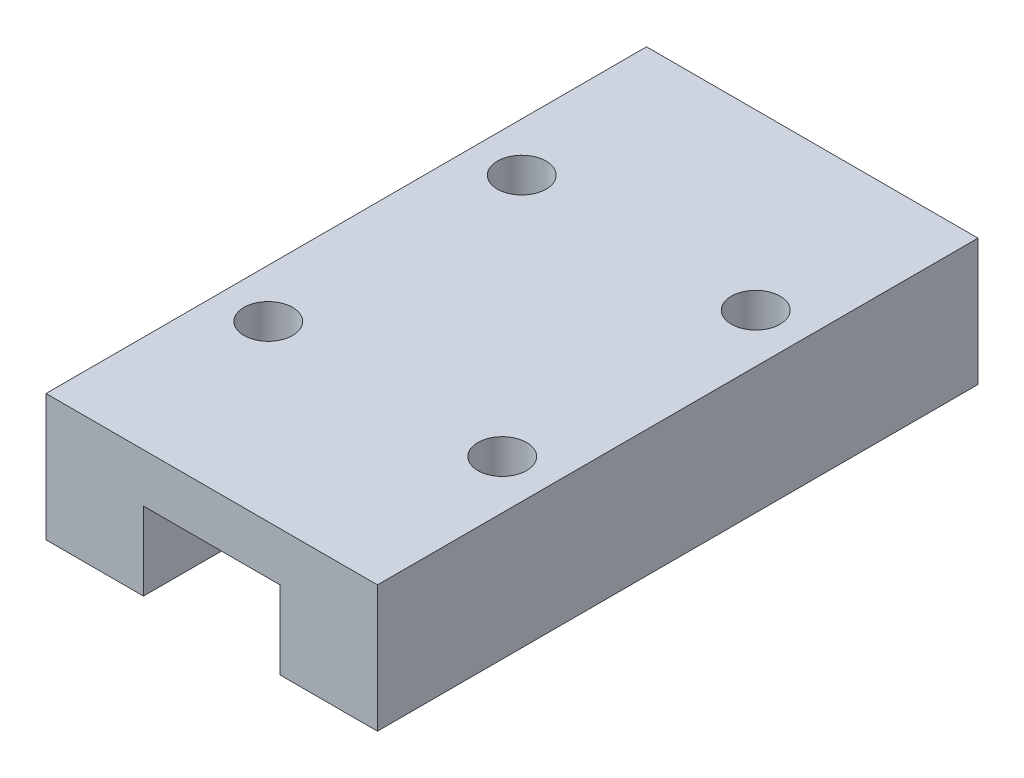
ISO-10303-21;
HEADER;
FILE_DESCRIPTION(('STEP AP214'),'2;1');
FILE_NAME('part.step','',(''),(''),'','','');
FILE_SCHEMA(('AUTOMOTIVE_DESIGN { 1 0 10303 214 1 1 1 1 }'));
ENDSEC;
DATA;
#1=APPLICATION_CONTEXT('core data for automotive mechanical design processes');
#2=APPLICATION_PROTOCOL_DEFINITION('international standard','automotive_design',2000,#1);
#3=PRODUCT_CONTEXT('',#1,'mechanical');
#4=PRODUCT('Part','Part','',(#3));
#5=PRODUCT_RELATED_PRODUCT_CATEGORY('part','',(#4));
#6=PRODUCT_DEFINITION_FORMATION('','',#4);
#7=PRODUCT_DEFINITION_CONTEXT('part definition',#1,'design');
#8=PRODUCT_DEFINITION('design','',#6,#7);
#9=PRODUCT_DEFINITION_SHAPE('','',#8);
#10=(LENGTH_UNIT() NAMED_UNIT(*) SI_UNIT(.MILLI.,.METRE.));
#11=(NAMED_UNIT(*) PLANE_ANGLE_UNIT() SI_UNIT($,.RADIAN.));
#12=(NAMED_UNIT(*) SI_UNIT($,.STERADIAN.) SOLID_ANGLE_UNIT());
#13=UNCERTAINTY_MEASURE_WITH_UNIT(LENGTH_MEASURE(1.E-05),#10,'distance_accuracy_value','');
#14=(GEOMETRIC_REPRESENTATION_CONTEXT(3) GLOBAL_UNCERTAINTY_ASSIGNED_CONTEXT((#13)) GLOBAL_UNIT_ASSIGNED_CONTEXT((#10,
#11,#12)) REPRESENTATION_CONTEXT('',''));
#15=CARTESIAN_POINT('',(0.,0.,0.));
#16=DIRECTION('',(0.,0.,1.));
#17=DIRECTION('',(1.,0.,0.));
#18=AXIS2_PLACEMENT_3D('',#15,#16,#17);
#19=CARTESIAN_POINT('',(0.,6.5,30.8));
#20=DIRECTION('',(1.,0.,0.));
#21=DIRECTION('',(0.,1.,0.));
#22=AXIS2_PLACEMENT_3D('',#19,#20,#21);
#23=PLANE('',#22);
#24=DIRECTION('',(0.,-1.,0.));
#25=VECTOR('',#24,1.);
#26=CARTESIAN_POINT('',(0.,6.5,0.));
#27=LINE('',#26,#25);
#28=CARTESIAN_POINT('',(0.,6.5,0.));
#29=VERTEX_POINT('',#28);
#30=CARTESIAN_POINT('',(0.,0.,0.));
#31=VERTEX_POINT('',#30);
#32=EDGE_CURVE('E135',#29,#31,#27,.T.);
#33=ORIENTED_EDGE('',*,*,#32,.T.);
#34=DIRECTION('',(0.,0.,-1.));
#35=VECTOR('',#34,1.);
#36=CARTESIAN_POINT('',(0.,0.,30.8));
#37=LINE('',#36,#35);
#38=CARTESIAN_POINT('',(0.,0.,30.8));
#39=VERTEX_POINT('',#38);
#40=EDGE_CURVE('E11',#39,#31,#37,.T.);
#41=ORIENTED_EDGE('',*,*,#40,.F.);
#42=DIRECTION('',(0.,-1.,0.));
#43=VECTOR('',#42,1.);
#44=CARTESIAN_POINT('',(0.,6.5,30.8));
#45=LINE('',#44,#43);
#46=CARTESIAN_POINT('',(0.,6.5,30.8));
#47=VERTEX_POINT('',#46);
#48=EDGE_CURVE('E150',#47,#39,#45,.T.);
#49=ORIENTED_EDGE('',*,*,#48,.F.);
#50=DIRECTION('',(0.,0.,-1.));
#51=VECTOR('',#50,1.);
#52=CARTESIAN_POINT('',(0.,6.5,30.8));
#53=LINE('',#52,#51);
#54=EDGE_CURVE('E131',#47,#29,#53,.T.);
#55=ORIENTED_EDGE('',*,*,#54,.T.);
#56=EDGE_LOOP('',(#33,#41,#49,#55));
#57=FACE_BOUND('',#56,.T.);
#58=ADVANCED_FACE('F39',(#57),#23,.F.);
#59=CARTESIAN_POINT('',(0.,0.,30.8));
#60=DIRECTION('',(0.,1.,0.));
#61=DIRECTION('',(0.,0.,1.));
#62=AXIS2_PLACEMENT_3D('',#59,#60,#61);
#63=PLANE('',#62);
#64=CARTESIAN_POINT('',(2.5,0.,8.9));
#65=DIRECTION('',(0.,1.,0.));
#66=DIRECTION('',(0.,0.,1.));
#67=AXIS2_PLACEMENT_3D('',#64,#65,#66);
#68=CIRCLE('',#67,1.25);
#69=CARTESIAN_POINT('',(1.25,0.,8.9));
#70=VERTEX_POINT('',#69);
#71=EDGE_CURVE('E139',#70,#70,#68,.T.);
#72=ORIENTED_EDGE('',*,*,#71,.T.);
#73=EDGE_LOOP('',(#72));
#74=FACE_BOUND('',#73,.T.);
#75=CARTESIAN_POINT('',(2.5,0.,21.9));
#76=DIRECTION('',(0.,1.,0.));
#77=DIRECTION('',(0.,0.,1.));
#78=AXIS2_PLACEMENT_3D('',#75,#76,#77);
#79=CIRCLE('',#78,1.25);
#80=CARTESIAN_POINT('',(1.25,0.,21.9));
#81=VERTEX_POINT('',#80);
#82=EDGE_CURVE('E185',#81,#81,#79,.T.);
#83=ORIENTED_EDGE('',*,*,#82,.T.);
#84=EDGE_LOOP('',(#83));
#85=FACE_BOUND('',#84,.T.);
#86=DIRECTION('',(1.,0.,0.));
#87=VECTOR('',#86,1.);
#88=CARTESIAN_POINT('',(0.,0.,0.));
#89=LINE('',#88,#87);
#90=CARTESIAN_POINT('',(5.,0.,0.));
#91=VERTEX_POINT('',#90);
#92=EDGE_CURVE('E138',#31,#91,#89,.T.);
#93=ORIENTED_EDGE('',*,*,#92,.T.);
#94=DIRECTION('',(0.,0.,-1.));
#95=VECTOR('',#94,1.);
#96=CARTESIAN_POINT('',(5.,0.,30.8));
#97=LINE('',#96,#95);
#98=CARTESIAN_POINT('',(5.,0.,30.8));
#99=VERTEX_POINT('',#98);
#100=EDGE_CURVE('E47',#99,#91,#97,.T.);
#101=ORIENTED_EDGE('',*,*,#100,.F.);
#102=DIRECTION('',(1.,0.,0.));
#103=VECTOR('',#102,1.);
#104=CARTESIAN_POINT('',(0.,0.,30.8));
#105=LINE('',#104,#103);
#106=EDGE_CURVE('E98',#39,#99,#105,.T.);
#107=ORIENTED_EDGE('',*,*,#106,.F.);
#108=ORIENTED_EDGE('',*,*,#40,.T.);
#109=EDGE_LOOP('',(#93,#101,#107,#108));
#110=FACE_BOUND('',#109,.T.);
#111=ADVANCED_FACE('F234',(#74,#85,#110),#63,.F.);
#112=CARTESIAN_POINT('',(5.,0.,30.8));
#113=DIRECTION('',(-1.,0.,0.));
#114=DIRECTION('',(0.,0.,1.));
#115=AXIS2_PLACEMENT_3D('',#112,#113,#114);
#116=PLANE('',#115);
#117=DIRECTION('',(0.,1.,0.));
#118=VECTOR('',#117,1.);
#119=CARTESIAN_POINT('',(5.,0.,0.));
#120=LINE('',#119,#118);
#121=CARTESIAN_POINT('',(5.,4.,0.));
#122=VERTEX_POINT('',#121);
#123=EDGE_CURVE('E141',#91,#122,#120,.T.);
#124=ORIENTED_EDGE('',*,*,#123,.T.);
#125=DIRECTION('',(0.,0.,-1.));
#126=VECTOR('',#125,1.);
#127=CARTESIAN_POINT('',(5.,4.,30.8));
#128=LINE('',#127,#126);
#129=CARTESIAN_POINT('',(5.,4.,30.8));
#130=VERTEX_POINT('',#129);
#131=EDGE_CURVE('E157',#130,#122,#128,.T.);
#132=ORIENTED_EDGE('',*,*,#131,.F.);
#133=DIRECTION('',(0.,1.,0.));
#134=VECTOR('',#133,1.);
#135=CARTESIAN_POINT('',(5.,0.,30.8));
#136=LINE('',#135,#134);
#137=EDGE_CURVE('E165',#99,#130,#136,.T.);
#138=ORIENTED_EDGE('',*,*,#137,.F.);
#139=ORIENTED_EDGE('',*,*,#100,.T.);
#140=EDGE_LOOP('',(#124,#132,#138,#139));
#141=FACE_BOUND('',#140,.T.);
#142=ADVANCED_FACE('F163',(#141),#116,.F.);
#143=CARTESIAN_POINT('',(5.,4.,30.8));
#144=DIRECTION('',(0.,1.,0.));
#145=DIRECTION('',(-1.,0.,0.));
#146=AXIS2_PLACEMENT_3D('',#143,#144,#145);
#147=PLANE('',#146);
#148=DIRECTION('',(1.,0.,0.));
#149=VECTOR('',#148,1.);
#150=CARTESIAN_POINT('',(5.,4.,0.));
#151=LINE('',#150,#149);
#152=CARTESIAN_POINT('',(12.,4.,0.));
#153=VERTEX_POINT('',#152);
#154=EDGE_CURVE('E143',#122,#153,#151,.T.);
#155=ORIENTED_EDGE('',*,*,#154,.T.);
#156=DIRECTION('',(0.,0.,-1.));
#157=VECTOR('',#156,1.);
#158=CARTESIAN_POINT('',(12.,4.,30.8));
#159=LINE('',#158,#157);
#160=CARTESIAN_POINT('',(12.,4.,30.8));
#161=VERTEX_POINT('',#160);
#162=EDGE_CURVE('E154',#161,#153,#159,.T.);
#163=ORIENTED_EDGE('',*,*,#162,.F.);
#164=DIRECTION('',(1.,0.,0.));
#165=VECTOR('',#164,1.);
#166=CARTESIAN_POINT('',(5.,4.,30.8));
#167=LINE('',#166,#165);
#168=EDGE_CURVE('E177',#130,#161,#167,.T.);
#169=ORIENTED_EDGE('',*,*,#168,.F.);
#170=ORIENTED_EDGE('',*,*,#131,.T.);
#171=EDGE_LOOP('',(#155,#163,#169,#170));
#172=FACE_BOUND('',#171,.T.);
#173=ADVANCED_FACE('F173',(#172),#147,.F.);
#174=CARTESIAN_POINT('',(12.,4.,30.8));
#175=DIRECTION('',(1.,0.,0.));
#176=DIRECTION('',(0.,0.,-1.));
#177=AXIS2_PLACEMENT_3D('',#174,#175,#176);
#178=PLANE('',#177);
#179=DIRECTION('',(0.,-1.,0.));
#180=VECTOR('',#179,1.);
#181=CARTESIAN_POINT('',(12.,4.,0.));
#182=LINE('',#181,#180);
#183=CARTESIAN_POINT('',(12.,0.,0.));
#184=VERTEX_POINT('',#183);
#185=EDGE_CURVE('E145',#153,#184,#182,.T.);
#186=ORIENTED_EDGE('',*,*,#185,.T.);
#187=DIRECTION('',(0.,0.,-1.));
#188=VECTOR('',#187,1.);
#189=CARTESIAN_POINT('',(12.,0.,30.8));
#190=LINE('',#189,#188);
#191=CARTESIAN_POINT('',(12.,0.,30.8));
#192=VERTEX_POINT('',#191);
#193=EDGE_CURVE('E126',#192,#184,#190,.T.);
#194=ORIENTED_EDGE('',*,*,#193,.F.);
#195=DIRECTION('',(0.,-1.,0.));
#196=VECTOR('',#195,1.);
#197=CARTESIAN_POINT('',(12.,4.,30.8));
#198=LINE('',#197,#196);
#199=EDGE_CURVE('E117',#161,#192,#198,.T.);
#200=ORIENTED_EDGE('',*,*,#199,.F.);
#201=ORIENTED_EDGE('',*,*,#162,.T.);
#202=EDGE_LOOP('',(#186,#194,#200,#201));
#203=FACE_BOUND('',#202,.T.);
#204=ADVANCED_FACE('F176',(#203),#178,.F.);
#205=CARTESIAN_POINT('',(12.,0.,30.8));
#206=DIRECTION('',(0.,1.,0.));
#207=DIRECTION('',(0.,0.,1.));
#208=AXIS2_PLACEMENT_3D('',#205,#206,#207);
#209=PLANE('',#208);
#210=CARTESIAN_POINT('',(14.5,0.,21.9));
#211=DIRECTION('',(0.,1.,0.));
#212=DIRECTION('',(0.,0.,1.));
#213=AXIS2_PLACEMENT_3D('',#210,#211,#212);
#214=CIRCLE('',#213,1.25);
#215=CARTESIAN_POINT('',(13.25,0.,21.9));
#216=VERTEX_POINT('',#215);
#217=EDGE_CURVE('E188',#216,#216,#214,.T.);
#218=ORIENTED_EDGE('',*,*,#217,.T.);
#219=EDGE_LOOP('',(#218));
#220=FACE_BOUND('',#219,.T.);
#221=CARTESIAN_POINT('',(14.5,0.,8.9));
#222=DIRECTION('',(0.,1.,0.));
#223=DIRECTION('',(0.,0.,1.));
#224=AXIS2_PLACEMENT_3D('',#221,#222,#223);
#225=CIRCLE('',#224,1.25);
#226=CARTESIAN_POINT('',(13.25,0.,8.9));
#227=VERTEX_POINT('',#226);
#228=EDGE_CURVE('E191',#227,#227,#225,.T.);
#229=ORIENTED_EDGE('',*,*,#228,.T.);
#230=EDGE_LOOP('',(#229));
#231=FACE_BOUND('',#230,.T.);
#232=DIRECTION('',(1.,0.,0.));
#233=VECTOR('',#232,1.);
#234=CARTESIAN_POINT('',(12.,0.,0.));
#235=LINE('',#234,#233);
#236=CARTESIAN_POINT('',(17.,0.,0.));
#237=VERTEX_POINT('',#236);
#238=EDGE_CURVE('E125',#184,#237,#235,.T.);
#239=ORIENTED_EDGE('',*,*,#238,.T.);
#240=DIRECTION('',(0.,0.,-1.));
#241=VECTOR('',#240,1.);
#242=CARTESIAN_POINT('',(17.,0.,30.8));
#243=LINE('',#242,#241);
#244=CARTESIAN_POINT('',(17.,0.,30.8));
#245=VERTEX_POINT('',#244);
#246=EDGE_CURVE('E122',#245,#237,#243,.T.);
#247=ORIENTED_EDGE('',*,*,#246,.F.);
#248=DIRECTION('',(1.,0.,0.));
#249=VECTOR('',#248,1.);
#250=CARTESIAN_POINT('',(12.,0.,30.8));
#251=LINE('',#250,#249);
#252=EDGE_CURVE('E111',#192,#245,#251,.T.);
#253=ORIENTED_EDGE('',*,*,#252,.F.);
#254=ORIENTED_EDGE('',*,*,#193,.T.);
#255=EDGE_LOOP('',(#239,#247,#253,#254));
#256=FACE_BOUND('',#255,.T.);
#257=ADVANCED_FACE('F123',(#220,#231,#256),#209,.F.);
#258=CARTESIAN_POINT('',(17.,0.,30.8));
#259=DIRECTION('',(-1.,0.,0.));
#260=DIRECTION('',(0.,0.,1.));
#261=AXIS2_PLACEMENT_3D('',#258,#259,#260);
#262=PLANE('',#261);
#263=DIRECTION('',(0.,1.,0.));
#264=VECTOR('',#263,1.);
#265=CARTESIAN_POINT('',(17.,0.,0.));
#266=LINE('',#265,#264);
#267=CARTESIAN_POINT('',(17.,6.5,0.));
#268=VERTEX_POINT('',#267);
#269=EDGE_CURVE('E84',#237,#268,#266,.T.);
#270=ORIENTED_EDGE('',*,*,#269,.T.);
#271=DIRECTION('',(0.,0.,-1.));
#272=VECTOR('',#271,1.);
#273=CARTESIAN_POINT('',(17.,6.5,30.8));
#274=LINE('',#273,#272);
#275=CARTESIAN_POINT('',(17.,6.5,30.8));
#276=VERTEX_POINT('',#275);
#277=EDGE_CURVE('E127',#276,#268,#274,.T.);
#278=ORIENTED_EDGE('',*,*,#277,.F.);
#279=DIRECTION('',(0.,1.,0.));
#280=VECTOR('',#279,1.);
#281=CARTESIAN_POINT('',(17.,0.,30.8));
#282=LINE('',#281,#280);
#283=EDGE_CURVE('E115',#245,#276,#282,.T.);
#284=ORIENTED_EDGE('',*,*,#283,.F.);
#285=ORIENTED_EDGE('',*,*,#246,.T.);
#286=EDGE_LOOP('',(#270,#278,#284,#285));
#287=FACE_BOUND('',#286,.T.);
#288=ADVANCED_FACE('F129',(#287),#262,.F.);
#289=CARTESIAN_POINT('',(17.,6.5,30.8));
#290=DIRECTION('',(0.,-1.,0.));
#291=DIRECTION('',(1.,0.,0.));
#292=AXIS2_PLACEMENT_3D('',#289,#290,#291);
#293=PLANE('',#292);
#294=CARTESIAN_POINT('',(2.5,6.5,8.9));
#295=DIRECTION('',(0.,1.,0.));
#296=DIRECTION('',(1.,0.,0.));
#297=AXIS2_PLACEMENT_3D('',#294,#295,#296);
#298=CIRCLE('',#297,1.25);
#299=CARTESIAN_POINT('',(1.25,6.5,8.9));
#300=VERTEX_POINT('',#299);
#301=EDGE_CURVE('E198',#300,#300,#298,.T.);
#302=ORIENTED_EDGE('',*,*,#301,.F.);
#303=EDGE_LOOP('',(#302));
#304=FACE_BOUND('',#303,.T.);
#305=CARTESIAN_POINT('',(2.5,6.5,21.9));
#306=DIRECTION('',(0.,1.,0.));
#307=DIRECTION('',(1.,0.,0.));
#308=AXIS2_PLACEMENT_3D('',#305,#306,#307);
#309=CIRCLE('',#308,1.25);
#310=CARTESIAN_POINT('',(1.25,6.5,21.9));
#311=VERTEX_POINT('',#310);
#312=EDGE_CURVE('E201',#311,#311,#309,.T.);
#313=ORIENTED_EDGE('',*,*,#312,.F.);
#314=EDGE_LOOP('',(#313));
#315=FACE_BOUND('',#314,.T.);
#316=CARTESIAN_POINT('',(14.5,6.5,21.9));
#317=DIRECTION('',(0.,1.,0.));
#318=DIRECTION('',(-1.,0.,0.));
#319=AXIS2_PLACEMENT_3D('',#316,#317,#318);
#320=CIRCLE('',#319,1.25);
#321=CARTESIAN_POINT('',(13.25,6.5,21.9));
#322=VERTEX_POINT('',#321);
#323=EDGE_CURVE('E197',#322,#322,#320,.T.);
#324=ORIENTED_EDGE('',*,*,#323,.F.);
#325=EDGE_LOOP('',(#324));
#326=FACE_BOUND('',#325,.T.);
#327=CARTESIAN_POINT('',(14.5,6.5,8.9));
#328=DIRECTION('',(0.,1.,0.));
#329=DIRECTION('',(-1.,0.,0.));
#330=AXIS2_PLACEMENT_3D('',#327,#328,#329);
#331=CIRCLE('',#330,1.25);
#332=CARTESIAN_POINT('',(13.25,6.5,8.9));
#333=VERTEX_POINT('',#332);
#334=EDGE_CURVE('E194',#333,#333,#331,.T.);
#335=ORIENTED_EDGE('',*,*,#334,.F.);
#336=EDGE_LOOP('',(#335));
#337=FACE_BOUND('',#336,.T.);
#338=DIRECTION('',(-1.,0.,0.));
#339=VECTOR('',#338,1.);
#340=CARTESIAN_POINT('',(17.,6.5,0.));
#341=LINE('',#340,#339);
#342=EDGE_CURVE('E90',#268,#29,#341,.T.);
#343=ORIENTED_EDGE('',*,*,#342,.T.);
#344=ORIENTED_EDGE('',*,*,#54,.F.);
#345=DIRECTION('',(-1.,0.,0.));
#346=VECTOR('',#345,1.);
#347=CARTESIAN_POINT('',(17.,6.5,30.8));
#348=LINE('',#347,#346);
#349=EDGE_CURVE('E55',#276,#47,#348,.T.);
#350=ORIENTED_EDGE('',*,*,#349,.F.);
#351=ORIENTED_EDGE('',*,*,#277,.T.);
#352=EDGE_LOOP('',(#343,#344,#350,#351));
#353=FACE_BOUND('',#352,.T.);
#354=ADVANCED_FACE('F210',(#304,#315,#326,#337,#353),#293,.F.);
#355=CARTESIAN_POINT('',(0.,0.,30.8));
#356=DIRECTION('',(0.,0.,1.));
#357=DIRECTION('',(1.,0.,0.));
#358=AXIS2_PLACEMENT_3D('',#355,#356,#357);
#359=PLANE('',#358);
#360=ORIENTED_EDGE('',*,*,#48,.T.);
#361=ORIENTED_EDGE('',*,*,#106,.T.);
#362=ORIENTED_EDGE('',*,*,#137,.T.);
#363=ORIENTED_EDGE('',*,*,#168,.T.);
#364=ORIENTED_EDGE('',*,*,#199,.T.);
#365=ORIENTED_EDGE('',*,*,#252,.T.);
#366=ORIENTED_EDGE('',*,*,#283,.T.);
#367=ORIENTED_EDGE('',*,*,#349,.T.);
#368=EDGE_LOOP('',(#360,#361,#362,#363,#364,#365,#366,#367));
#369=FACE_BOUND('',#368,.T.);
#370=ADVANCED_FACE('F113',(#369),#359,.T.);
#371=CARTESIAN_POINT('',(0.,0.,0.));
#372=DIRECTION('',(0.,0.,1.));
#373=DIRECTION('',(1.,0.,0.));
#374=AXIS2_PLACEMENT_3D('',#371,#372,#373);
#375=PLANE('',#374);
#376=ORIENTED_EDGE('',*,*,#32,.F.);
#377=ORIENTED_EDGE('',*,*,#342,.F.);
#378=ORIENTED_EDGE('',*,*,#269,.F.);
#379=ORIENTED_EDGE('',*,*,#238,.F.);
#380=ORIENTED_EDGE('',*,*,#185,.F.);
#381=ORIENTED_EDGE('',*,*,#154,.F.);
#382=ORIENTED_EDGE('',*,*,#123,.F.);
#383=ORIENTED_EDGE('',*,*,#92,.F.);
#384=EDGE_LOOP('',(#376,#377,#378,#379,#380,#381,#382,#383));
#385=FACE_BOUND('',#384,.T.);
#386=ADVANCED_FACE('F169',(#385),#375,.F.);
#387=CARTESIAN_POINT('',(14.5,-16.,8.9));
#388=DIRECTION('',(0.,1.,0.));
#389=DIRECTION('',(-1.,0.,0.));
#390=AXIS2_PLACEMENT_3D('',#387,#388,#389);
#391=CYLINDRICAL_SURFACE('',#390,1.25);
#392=CARTESIAN_POINT('',(13.25,6.5,8.9));
#393=CARTESIAN_POINT('',(13.25,6.43229166666667,8.9));
#394=CARTESIAN_POINT('',(13.25,6.36458333333334,8.9));
#395=CARTESIAN_POINT('',(13.25,6.22916666666667,8.9));
#396=CARTESIAN_POINT('',(13.25,6.16145833333334,8.9));
#397=CARTESIAN_POINT('',(13.25,6.02604166666667,8.9));
#398=CARTESIAN_POINT('',(13.25,5.95833333333333,8.9));
#399=CARTESIAN_POINT('',(13.25,5.82291666666667,8.9));
#400=CARTESIAN_POINT('',(13.25,5.75520833333333,8.9));
#401=CARTESIAN_POINT('',(13.25,5.61979166666667,8.9));
#402=CARTESIAN_POINT('',(13.25,5.55208333333334,8.9));
#403=CARTESIAN_POINT('',(13.25,5.41666666666667,8.9));
#404=CARTESIAN_POINT('',(13.25,5.34895833333333,8.9));
#405=CARTESIAN_POINT('',(13.25,5.21354166666667,8.9));
#406=CARTESIAN_POINT('',(13.25,5.14583333333333,8.9));
#407=CARTESIAN_POINT('',(13.25,5.01041666666667,8.9));
#408=CARTESIAN_POINT('',(13.25,4.94270833333333,8.9));
#409=CARTESIAN_POINT('',(13.25,4.80729166666667,8.9));
#410=CARTESIAN_POINT('',(13.25,4.73958333333333,8.9));
#411=CARTESIAN_POINT('',(13.25,4.60416666666667,8.9));
#412=CARTESIAN_POINT('',(13.25,4.53645833333333,8.9));
#413=CARTESIAN_POINT('',(13.25,4.40104166666667,8.9));
#414=CARTESIAN_POINT('',(13.25,4.33333333333333,8.9));
#415=CARTESIAN_POINT('',(13.25,4.19791666666667,8.9));
#416=CARTESIAN_POINT('',(13.25,4.13020833333333,8.9));
#417=CARTESIAN_POINT('',(13.25,3.99479166666667,8.9));
#418=CARTESIAN_POINT('',(13.25,3.92708333333333,8.9));
#419=CARTESIAN_POINT('',(13.25,3.79166666666667,8.9));
#420=CARTESIAN_POINT('',(13.25,3.72395833333333,8.9));
#421=CARTESIAN_POINT('',(13.25,3.58854166666667,8.9));
#422=CARTESIAN_POINT('',(13.25,3.52083333333333,8.9));
#423=CARTESIAN_POINT('',(13.25,3.38541666666667,8.9));
#424=CARTESIAN_POINT('',(13.25,3.31770833333333,8.9));
#425=CARTESIAN_POINT('',(13.25,3.18229166666667,8.9));
#426=CARTESIAN_POINT('',(13.25,3.11458333333333,8.9));
#427=CARTESIAN_POINT('',(13.25,2.97916666666667,8.9));
#428=CARTESIAN_POINT('',(13.25,2.91145833333333,8.9));
#429=CARTESIAN_POINT('',(13.25,2.77604166666666,8.9));
#430=CARTESIAN_POINT('',(13.25,2.70833333333333,8.9));
#431=CARTESIAN_POINT('',(13.25,2.57291666666666,8.9));
#432=CARTESIAN_POINT('',(13.25,2.50520833333333,8.9));
#433=CARTESIAN_POINT('',(13.25,2.36979166666667,8.9));
#434=CARTESIAN_POINT('',(13.25,2.30208333333333,8.9));
#435=CARTESIAN_POINT('',(13.25,2.16666666666667,8.9));
#436=CARTESIAN_POINT('',(13.25,2.09895833333333,8.9));
#437=CARTESIAN_POINT('',(13.25,1.96354166666666,8.9));
#438=CARTESIAN_POINT('',(13.25,1.89583333333333,8.9));
#439=CARTESIAN_POINT('',(13.25,1.76041666666666,8.9));
#440=CARTESIAN_POINT('',(13.25,1.69270833333333,8.9));
#441=CARTESIAN_POINT('',(13.25,1.55729166666667,8.9));
#442=CARTESIAN_POINT('',(13.25,1.48958333333333,8.9));
#443=CARTESIAN_POINT('',(13.25,1.35416666666667,8.9));
#444=CARTESIAN_POINT('',(13.25,1.28645833333333,8.9));
#445=CARTESIAN_POINT('',(13.25,1.15104166666666,8.9));
#446=CARTESIAN_POINT('',(13.25,1.08333333333333,8.9));
#447=CARTESIAN_POINT('',(13.25,0.947916666666663,8.9));
#448=CARTESIAN_POINT('',(13.25,0.88020833333333,8.9));
#449=CARTESIAN_POINT('',(13.25,0.744791666666664,8.9));
#450=CARTESIAN_POINT('',(13.25,0.677083333333332,8.9));
#451=CARTESIAN_POINT('',(13.25,0.541666666666665,8.9));
#452=CARTESIAN_POINT('',(13.25,0.473958333333331,8.9));
#453=CARTESIAN_POINT('',(13.25,0.338541666666663,8.9));
#454=CARTESIAN_POINT('',(13.25,0.270833333333329,8.9));
#455=CARTESIAN_POINT('',(13.25,0.135416666666662,8.9));
#456=CARTESIAN_POINT('',(13.25,0.0677083333333294,8.9));
#457=CARTESIAN_POINT('',(13.25,0.,8.9));
#458=B_SPLINE_CURVE_WITH_KNOTS('',3,(#392,#393,#394,#395,#396,#397,#398,#399,#400,#401,#402,
#403,#404,#405,#406,#407,#408,#409,#410,#411,#412,#413,#414,#415,#416,#417,#418,#419,#420,#421,
#422,#423,#424,#425,#426,#427,#428,#429,#430,#431,#432,#433,#434,#435,#436,#437,#438,#439,#440,
#441,#442,#443,#444,#445,#446,#447,#448,#449,#450,#451,#452,#453,#454,#455,#456,#457),
.UNSPECIFIED.,.F.,.F.,(4,2,2,2,2,2,2,2,2,2,2,2,2,2,2,2,2,2,2,2,2,2,2,2,2,2,2,2,2,2,2,2,4),(0.,
0.203124999999998,0.40625,0.609375000000002,0.812500000000001,1.015625,1.21875,1.421875,1.625,
1.828125,2.03125,2.234375,2.4375,2.640625,2.84375,3.046875,3.25,3.453125,3.65625,
3.85937500000001,4.0625,4.265625,4.46875,4.67187500000001,4.875,5.078125,5.28125,
5.48437500000001,5.68750000000001,5.890625,6.09375000000001,6.29687500000001,6.50000000000001),.UNSPECIFIED.);
#459=EDGE_CURVE('BSEAM217',#333,#227,#458,.T.);
#460=ORIENTED_EDGE('',*,*,#334,.T.);
#461=ORIENTED_EDGE('',*,*,#228,.F.);
#462=ORIENTED_EDGE('',*,*,#459,.T.);
#463=ORIENTED_EDGE('',*,*,#459,.F.);
#464=EDGE_LOOP('',(#460,#462,#461,#463));
#465=FACE_BOUND('',#464,.T.);
#466=ADVANCED_FACE('F217',(#465),#391,.F.);
#467=CARTESIAN_POINT('',(14.5,-16.,21.9));
#468=DIRECTION('',(0.,1.,0.));
#469=DIRECTION('',(-1.,0.,0.));
#470=AXIS2_PLACEMENT_3D('',#467,#468,#469);
#471=CYLINDRICAL_SURFACE('',#470,1.25);
#472=CARTESIAN_POINT('',(13.25,6.5,21.9));
#473=CARTESIAN_POINT('',(13.25,6.43229166666667,21.9));
#474=CARTESIAN_POINT('',(13.25,6.36458333333334,21.9));
#475=CARTESIAN_POINT('',(13.25,6.22916666666667,21.9));
#476=CARTESIAN_POINT('',(13.25,6.16145833333334,21.9));
#477=CARTESIAN_POINT('',(13.25,6.02604166666667,21.9));
#478=CARTESIAN_POINT('',(13.25,5.95833333333333,21.9));
#479=CARTESIAN_POINT('',(13.25,5.82291666666667,21.9));
#480=CARTESIAN_POINT('',(13.25,5.75520833333333,21.9));
#481=CARTESIAN_POINT('',(13.25,5.61979166666667,21.9));
#482=CARTESIAN_POINT('',(13.25,5.55208333333334,21.9));
#483=CARTESIAN_POINT('',(13.25,5.41666666666667,21.9));
#484=CARTESIAN_POINT('',(13.25,5.34895833333333,21.9));
#485=CARTESIAN_POINT('',(13.25,5.21354166666667,21.9));
#486=CARTESIAN_POINT('',(13.25,5.14583333333333,21.9));
#487=CARTESIAN_POINT('',(13.25,5.01041666666667,21.9));
#488=CARTESIAN_POINT('',(13.25,4.94270833333333,21.9));
#489=CARTESIAN_POINT('',(13.25,4.80729166666667,21.9));
#490=CARTESIAN_POINT('',(13.25,4.73958333333333,21.9));
#491=CARTESIAN_POINT('',(13.25,4.60416666666667,21.9));
#492=CARTESIAN_POINT('',(13.25,4.53645833333333,21.9));
#493=CARTESIAN_POINT('',(13.25,4.40104166666667,21.9));
#494=CARTESIAN_POINT('',(13.25,4.33333333333333,21.9));
#495=CARTESIAN_POINT('',(13.25,4.19791666666667,21.9));
#496=CARTESIAN_POINT('',(13.25,4.13020833333333,21.9));
#497=CARTESIAN_POINT('',(13.25,3.99479166666667,21.9));
#498=CARTESIAN_POINT('',(13.25,3.92708333333333,21.9));
#499=CARTESIAN_POINT('',(13.25,3.79166666666667,21.9));
#500=CARTESIAN_POINT('',(13.25,3.72395833333333,21.9));
#501=CARTESIAN_POINT('',(13.25,3.58854166666667,21.9));
#502=CARTESIAN_POINT('',(13.25,3.52083333333333,21.9));
#503=CARTESIAN_POINT('',(13.25,3.38541666666667,21.9));
#504=CARTESIAN_POINT('',(13.25,3.31770833333333,21.9));
#505=CARTESIAN_POINT('',(13.25,3.18229166666667,21.9));
#506=CARTESIAN_POINT('',(13.25,3.11458333333333,21.9));
#507=CARTESIAN_POINT('',(13.25,2.97916666666667,21.9));
#508=CARTESIAN_POINT('',(13.25,2.91145833333333,21.9));
#509=CARTESIAN_POINT('',(13.25,2.77604166666666,21.9));
#510=CARTESIAN_POINT('',(13.25,2.70833333333333,21.9));
#511=CARTESIAN_POINT('',(13.25,2.57291666666666,21.9));
#512=CARTESIAN_POINT('',(13.25,2.50520833333333,21.9));
#513=CARTESIAN_POINT('',(13.25,2.36979166666667,21.9));
#514=CARTESIAN_POINT('',(13.25,2.30208333333333,21.9));
#515=CARTESIAN_POINT('',(13.25,2.16666666666667,21.9));
#516=CARTESIAN_POINT('',(13.25,2.09895833333333,21.9));
#517=CARTESIAN_POINT('',(13.25,1.96354166666666,21.9));
#518=CARTESIAN_POINT('',(13.25,1.89583333333333,21.9));
#519=CARTESIAN_POINT('',(13.25,1.76041666666666,21.9));
#520=CARTESIAN_POINT('',(13.25,1.69270833333333,21.9));
#521=CARTESIAN_POINT('',(13.25,1.55729166666667,21.9));
#522=CARTESIAN_POINT('',(13.25,1.48958333333333,21.9));
#523=CARTESIAN_POINT('',(13.25,1.35416666666667,21.9));
#524=CARTESIAN_POINT('',(13.25,1.28645833333333,21.9));
#525=CARTESIAN_POINT('',(13.25,1.15104166666666,21.9));
#526=CARTESIAN_POINT('',(13.25,1.08333333333333,21.9));
#527=CARTESIAN_POINT('',(13.25,0.947916666666663,21.9));
#528=CARTESIAN_POINT('',(13.25,0.88020833333333,21.9));
#529=CARTESIAN_POINT('',(13.25,0.744791666666664,21.9));
#530=CARTESIAN_POINT('',(13.25,0.677083333333332,21.9));
#531=CARTESIAN_POINT('',(13.25,0.541666666666665,21.9));
#532=CARTESIAN_POINT('',(13.25,0.473958333333331,21.9));
#533=CARTESIAN_POINT('',(13.25,0.338541666666663,21.9));
#534=CARTESIAN_POINT('',(13.25,0.270833333333329,21.9));
#535=CARTESIAN_POINT('',(13.25,0.135416666666662,21.9));
#536=CARTESIAN_POINT('',(13.25,0.0677083333333294,21.9));
#537=CARTESIAN_POINT('',(13.25,0.,21.9));
#538=B_SPLINE_CURVE_WITH_KNOTS('',3,(#472,#473,#474,#475,#476,#477,#478,#479,#480,#481,#482,
#483,#484,#485,#486,#487,#488,#489,#490,#491,#492,#493,#494,#495,#496,#497,#498,#499,#500,#501,
#502,#503,#504,#505,#506,#507,#508,#509,#510,#511,#512,#513,#514,#515,#516,#517,#518,#519,#520,
#521,#522,#523,#524,#525,#526,#527,#528,#529,#530,#531,#532,#533,#534,#535,#536,#537),
.UNSPECIFIED.,.F.,.F.,(4,2,2,2,2,2,2,2,2,2,2,2,2,2,2,2,2,2,2,2,2,2,2,2,2,2,2,2,2,2,2,2,4),(0.,
0.203124999999998,0.40625,0.609375000000002,0.812500000000001,1.015625,1.21875,1.421875,1.625,
1.828125,2.03125,2.234375,2.4375,2.640625,2.84375,3.046875,3.25,3.453125,3.65625,
3.85937500000001,4.0625,4.265625,4.46875,4.67187500000001,4.875,5.078125,5.28125,
5.48437500000001,5.68750000000001,5.890625,6.09375000000001,6.29687500000001,6.50000000000001),.UNSPECIFIED.);
#539=EDGE_CURVE('BSEAM207',#322,#216,#538,.T.);
#540=ORIENTED_EDGE('',*,*,#323,.T.);
#541=ORIENTED_EDGE('',*,*,#217,.F.);
#542=ORIENTED_EDGE('',*,*,#539,.T.);
#543=ORIENTED_EDGE('',*,*,#539,.F.);
#544=EDGE_LOOP('',(#540,#542,#541,#543));
#545=FACE_BOUND('',#544,.T.);
#546=ADVANCED_FACE('F207',(#545),#471,.F.);
#547=CARTESIAN_POINT('',(2.5,-16.,21.9));
#548=DIRECTION('',(0.,1.,0.));
#549=DIRECTION('',(-1.,0.,0.));
#550=AXIS2_PLACEMENT_3D('',#547,#548,#549);
#551=CYLINDRICAL_SURFACE('',#550,1.25);
#552=CARTESIAN_POINT('',(1.25,6.5,21.9));
#553=CARTESIAN_POINT('',(1.25,6.43229166666666,21.9));
#554=CARTESIAN_POINT('',(1.25,6.36458333333333,21.9));
#555=CARTESIAN_POINT('',(1.25,6.22916666666666,21.9));
#556=CARTESIAN_POINT('',(1.25,6.16145833333333,21.9));
#557=CARTESIAN_POINT('',(1.25,6.02604166666666,21.9));
#558=CARTESIAN_POINT('',(1.25,5.95833333333333,21.9));
#559=CARTESIAN_POINT('',(1.25,5.82291666666666,21.9));
#560=CARTESIAN_POINT('',(1.25,5.75520833333333,21.9));
#561=CARTESIAN_POINT('',(1.25,5.61979166666666,21.9));
#562=CARTESIAN_POINT('',(1.25,5.55208333333333,21.9));
#563=CARTESIAN_POINT('',(1.25,5.41666666666666,21.9));
#564=CARTESIAN_POINT('',(1.25,5.34895833333333,21.9));
#565=CARTESIAN_POINT('',(1.25,5.21354166666666,21.9));
#566=CARTESIAN_POINT('',(1.25,5.14583333333333,21.9));
#567=CARTESIAN_POINT('',(1.25,5.01041666666666,21.9));
#568=CARTESIAN_POINT('',(1.25,4.94270833333333,21.9));
#569=CARTESIAN_POINT('',(1.25,4.80729166666666,21.9));
#570=CARTESIAN_POINT('',(1.25,4.73958333333333,21.9));
#571=CARTESIAN_POINT('',(1.25,4.60416666666666,21.9));
#572=CARTESIAN_POINT('',(1.25,4.53645833333333,21.9));
#573=CARTESIAN_POINT('',(1.25,4.40104166666666,21.9));
#574=CARTESIAN_POINT('',(1.25,4.33333333333333,21.9));
#575=CARTESIAN_POINT('',(1.25,4.19791666666666,21.9));
#576=CARTESIAN_POINT('',(1.25,4.13020833333333,21.9));
#577=CARTESIAN_POINT('',(1.25,3.99479166666666,21.9));
#578=CARTESIAN_POINT('',(1.25,3.92708333333333,21.9));
#579=CARTESIAN_POINT('',(1.25,3.79166666666666,21.9));
#580=CARTESIAN_POINT('',(1.25,3.72395833333333,21.9));
#581=CARTESIAN_POINT('',(1.25,3.58854166666666,21.9));
#582=CARTESIAN_POINT('',(1.25,3.52083333333333,21.9));
#583=CARTESIAN_POINT('',(1.25,3.38541666666666,21.9));
#584=CARTESIAN_POINT('',(1.25,3.31770833333333,21.9));
#585=CARTESIAN_POINT('',(1.25,3.18229166666666,21.9));
#586=CARTESIAN_POINT('',(1.25,3.11458333333333,21.9));
#587=CARTESIAN_POINT('',(1.25,2.97916666666666,21.9));
#588=CARTESIAN_POINT('',(1.25,2.91145833333333,21.9));
#589=CARTESIAN_POINT('',(1.25,2.77604166666666,21.9));
#590=CARTESIAN_POINT('',(1.25,2.70833333333333,21.9));
#591=CARTESIAN_POINT('',(1.25,2.57291666666666,21.9));
#592=CARTESIAN_POINT('',(1.25,2.50520833333333,21.9));
#593=CARTESIAN_POINT('',(1.25,2.36979166666666,21.9));
#594=CARTESIAN_POINT('',(1.25,2.30208333333333,21.9));
#595=CARTESIAN_POINT('',(1.25,2.16666666666666,21.9));
#596=CARTESIAN_POINT('',(1.25,2.09895833333333,21.9));
#597=CARTESIAN_POINT('',(1.25,1.96354166666666,21.9));
#598=CARTESIAN_POINT('',(1.25,1.89583333333333,21.9));
#599=CARTESIAN_POINT('',(1.25,1.76041666666666,21.9));
#600=CARTESIAN_POINT('',(1.25,1.69270833333333,21.9));
#601=CARTESIAN_POINT('',(1.25,1.55729166666666,21.9));
#602=CARTESIAN_POINT('',(1.25,1.48958333333333,21.9));
#603=CARTESIAN_POINT('',(1.25,1.35416666666666,21.9));
#604=CARTESIAN_POINT('',(1.25,1.28645833333333,21.9));
#605=CARTESIAN_POINT('',(1.25,1.15104166666666,21.9));
#606=CARTESIAN_POINT('',(1.25,1.08333333333333,21.9));
#607=CARTESIAN_POINT('',(1.25,0.947916666666663,21.9));
#608=CARTESIAN_POINT('',(1.25,0.88020833333333,21.9));
#609=CARTESIAN_POINT('',(1.25,0.744791666666663,21.9));
#610=CARTESIAN_POINT('',(1.25,0.677083333333329,21.9));
#611=CARTESIAN_POINT('',(1.25,0.541666666666663,21.9));
#612=CARTESIAN_POINT('',(1.25,0.47395833333333,21.9));
#613=CARTESIAN_POINT('',(1.25,0.338541666666663,21.9));
#614=CARTESIAN_POINT('',(1.25,0.270833333333329,21.9));
#615=CARTESIAN_POINT('',(1.25,0.135416666666662,21.9));
#616=CARTESIAN_POINT('',(1.25,0.0677083333333293,21.9));
#617=CARTESIAN_POINT('',(1.25,0.,21.9));
#618=B_SPLINE_CURVE_WITH_KNOTS('',3,(#552,#553,#554,#555,#556,#557,#558,#559,#560,#561,#562,
#563,#564,#565,#566,#567,#568,#569,#570,#571,#572,#573,#574,#575,#576,#577,#578,#579,#580,#581,
#582,#583,#584,#585,#586,#587,#588,#589,#590,#591,#592,#593,#594,#595,#596,#597,#598,#599,#600,
#601,#602,#603,#604,#605,#606,#607,#608,#609,#610,#611,#612,#613,#614,#615,#616,#617),
.UNSPECIFIED.,.F.,.F.,(4,2,2,2,2,2,2,2,2,2,2,2,2,2,2,2,2,2,2,2,2,2,2,2,2,2,2,2,2,2,2,2,4),(0.,
0.203124999999998,0.40625,0.609374999999999,0.812500000000001,1.015625,1.21875,1.421875,1.625,
1.828125,2.03125,2.234375,2.4375,2.640625,2.84375,3.046875,3.25,3.453125,3.65625,3.859375,
4.0625,4.265625,4.46875,4.671875,4.875,5.078125,5.28125,5.484375,5.6875,5.890625,6.09375,
6.296875,6.5),.UNSPECIFIED.);
#619=EDGE_CURVE('BSEAM293',#311,#81,#618,.T.);
#620=ORIENTED_EDGE('',*,*,#312,.T.);
#621=ORIENTED_EDGE('',*,*,#82,.F.);
#622=ORIENTED_EDGE('',*,*,#619,.T.);
#623=ORIENTED_EDGE('',*,*,#619,.F.);
#624=EDGE_LOOP('',(#620,#622,#621,#623));
#625=FACE_BOUND('',#624,.T.);
#626=ADVANCED_FACE('F293',(#625),#551,.F.);
#627=CARTESIAN_POINT('',(2.5,-16.,8.9));
#628=DIRECTION('',(0.,1.,0.));
#629=DIRECTION('',(-1.,0.,0.));
#630=AXIS2_PLACEMENT_3D('',#627,#628,#629);
#631=CYLINDRICAL_SURFACE('',#630,1.25);
#632=CARTESIAN_POINT('',(1.25,6.5,8.9));
#633=CARTESIAN_POINT('',(1.25,6.43229166666666,8.9));
#634=CARTESIAN_POINT('',(1.25,6.36458333333333,8.9));
#635=CARTESIAN_POINT('',(1.25,6.22916666666666,8.9));
#636=CARTESIAN_POINT('',(1.25,6.16145833333333,8.9));
#637=CARTESIAN_POINT('',(1.25,6.02604166666666,8.9));
#638=CARTESIAN_POINT('',(1.25,5.95833333333333,8.9));
#639=CARTESIAN_POINT('',(1.25,5.82291666666666,8.9));
#640=CARTESIAN_POINT('',(1.25,5.75520833333333,8.9));
#641=CARTESIAN_POINT('',(1.25,5.61979166666666,8.9));
#642=CARTESIAN_POINT('',(1.25,5.55208333333333,8.9));
#643=CARTESIAN_POINT('',(1.25,5.41666666666666,8.9));
#644=CARTESIAN_POINT('',(1.25,5.34895833333333,8.9));
#645=CARTESIAN_POINT('',(1.25,5.21354166666666,8.9));
#646=CARTESIAN_POINT('',(1.25,5.14583333333333,8.9));
#647=CARTESIAN_POINT('',(1.25,5.01041666666666,8.9));
#648=CARTESIAN_POINT('',(1.25,4.94270833333333,8.9));
#649=CARTESIAN_POINT('',(1.25,4.80729166666666,8.9));
#650=CARTESIAN_POINT('',(1.25,4.73958333333333,8.9));
#651=CARTESIAN_POINT('',(1.25,4.60416666666666,8.9));
#652=CARTESIAN_POINT('',(1.25,4.53645833333333,8.9));
#653=CARTESIAN_POINT('',(1.25,4.40104166666666,8.9));
#654=CARTESIAN_POINT('',(1.25,4.33333333333333,8.9));
#655=CARTESIAN_POINT('',(1.25,4.19791666666666,8.9));
#656=CARTESIAN_POINT('',(1.25,4.13020833333333,8.9));
#657=CARTESIAN_POINT('',(1.25,3.99479166666666,8.9));
#658=CARTESIAN_POINT('',(1.25,3.92708333333333,8.9));
#659=CARTESIAN_POINT('',(1.25,3.79166666666666,8.9));
#660=CARTESIAN_POINT('',(1.25,3.72395833333333,8.9));
#661=CARTESIAN_POINT('',(1.25,3.58854166666666,8.9));
#662=CARTESIAN_POINT('',(1.25,3.52083333333333,8.9));
#663=CARTESIAN_POINT('',(1.25,3.38541666666666,8.9));
#664=CARTESIAN_POINT('',(1.25,3.31770833333333,8.9));
#665=CARTESIAN_POINT('',(1.25,3.18229166666666,8.9));
#666=CARTESIAN_POINT('',(1.25,3.11458333333333,8.9));
#667=CARTESIAN_POINT('',(1.25,2.97916666666666,8.9));
#668=CARTESIAN_POINT('',(1.25,2.91145833333333,8.9));
#669=CARTESIAN_POINT('',(1.25,2.77604166666666,8.9));
#670=CARTESIAN_POINT('',(1.25,2.70833333333333,8.9));
#671=CARTESIAN_POINT('',(1.25,2.57291666666666,8.9));
#672=CARTESIAN_POINT('',(1.25,2.50520833333333,8.9));
#673=CARTESIAN_POINT('',(1.25,2.36979166666666,8.9));
#674=CARTESIAN_POINT('',(1.25,2.30208333333333,8.9));
#675=CARTESIAN_POINT('',(1.25,2.16666666666666,8.9));
#676=CARTESIAN_POINT('',(1.25,2.09895833333333,8.9));
#677=CARTESIAN_POINT('',(1.25,1.96354166666666,8.9));
#678=CARTESIAN_POINT('',(1.25,1.89583333333333,8.9));
#679=CARTESIAN_POINT('',(1.25,1.76041666666666,8.9));
#680=CARTESIAN_POINT('',(1.25,1.69270833333333,8.9));
#681=CARTESIAN_POINT('',(1.25,1.55729166666666,8.9));
#682=CARTESIAN_POINT('',(1.25,1.48958333333333,8.9));
#683=CARTESIAN_POINT('',(1.25,1.35416666666666,8.9));
#684=CARTESIAN_POINT('',(1.25,1.28645833333333,8.9));
#685=CARTESIAN_POINT('',(1.25,1.15104166666666,8.9));
#686=CARTESIAN_POINT('',(1.25,1.08333333333333,8.9));
#687=CARTESIAN_POINT('',(1.25,0.947916666666663,8.9));
#688=CARTESIAN_POINT('',(1.25,0.88020833333333,8.9));
#689=CARTESIAN_POINT('',(1.25,0.744791666666663,8.9));
#690=CARTESIAN_POINT('',(1.25,0.677083333333329,8.9));
#691=CARTESIAN_POINT('',(1.25,0.541666666666663,8.9));
#692=CARTESIAN_POINT('',(1.25,0.47395833333333,8.9));
#693=CARTESIAN_POINT('',(1.25,0.338541666666663,8.9));
#694=CARTESIAN_POINT('',(1.25,0.270833333333329,8.9));
#695=CARTESIAN_POINT('',(1.25,0.135416666666662,8.9));
#696=CARTESIAN_POINT('',(1.25,0.0677083333333293,8.9));
#697=CARTESIAN_POINT('',(1.25,0.,8.9));
#698=B_SPLINE_CURVE_WITH_KNOTS('',3,(#632,#633,#634,#635,#636,#637,#638,#639,#640,#641,#642,
#643,#644,#645,#646,#647,#648,#649,#650,#651,#652,#653,#654,#655,#656,#657,#658,#659,#660,#661,
#662,#663,#664,#665,#666,#667,#668,#669,#670,#671,#672,#673,#674,#675,#676,#677,#678,#679,#680,
#681,#682,#683,#684,#685,#686,#687,#688,#689,#690,#691,#692,#693,#694,#695,#696,#697),
.UNSPECIFIED.,.F.,.F.,(4,2,2,2,2,2,2,2,2,2,2,2,2,2,2,2,2,2,2,2,2,2,2,2,2,2,2,2,2,2,2,2,4),(0.,
0.203124999999998,0.40625,0.609374999999999,0.812500000000001,1.015625,1.21875,1.421875,1.625,
1.828125,2.03125,2.234375,2.4375,2.640625,2.84375,3.046875,3.25,3.453125,3.65625,3.859375,
4.0625,4.265625,4.46875,4.671875,4.875,5.078125,5.28125,5.484375,5.6875,5.890625,6.09375,
6.296875,6.5),.UNSPECIFIED.);
#699=EDGE_CURVE('BSEAM302',#300,#70,#698,.T.);
#700=ORIENTED_EDGE('',*,*,#301,.T.);
#701=ORIENTED_EDGE('',*,*,#71,.F.);
#702=ORIENTED_EDGE('',*,*,#699,.T.);
#703=ORIENTED_EDGE('',*,*,#699,.F.);
#704=EDGE_LOOP('',(#700,#702,#701,#703));
#705=FACE_BOUND('',#704,.T.);
#706=ADVANCED_FACE('F302',(#705),#631,.F.);
#707=CLOSED_SHELL('',(#58,#111,#142,#173,#204,#257,#288,#354,#370,#386,#466,#546,#626,#706));
#708=MANIFOLD_SOLID_BREP('B2',#707);
#709=ADVANCED_BREP_SHAPE_REPRESENTATION('',(#18,#708),#14);
#710=SHAPE_DEFINITION_REPRESENTATION(#9,#709);
ENDSEC;
END-ISO-10303-21;
